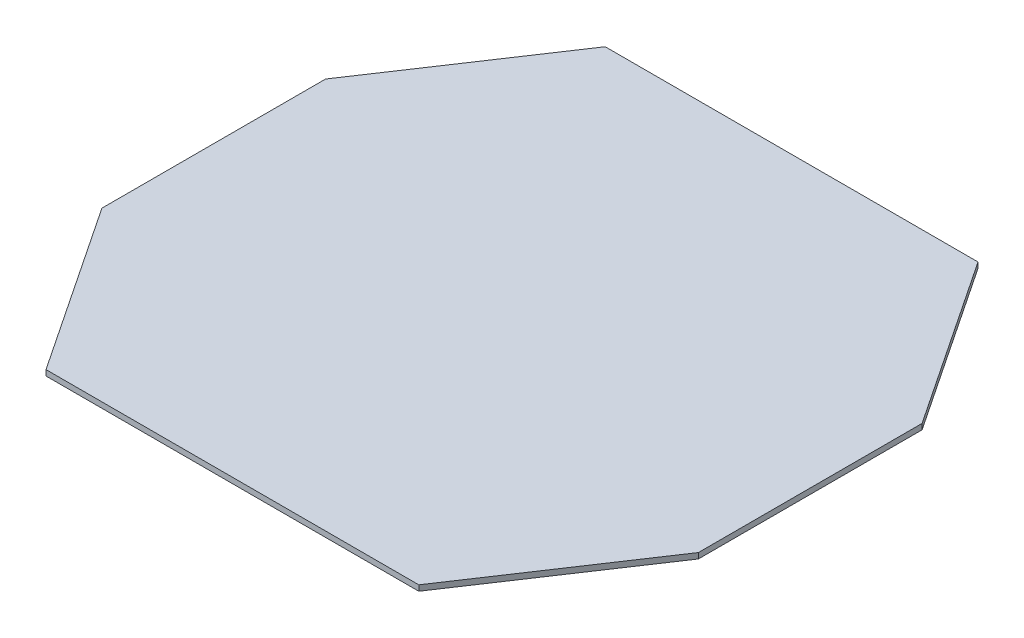
ISO-10303-21;
HEADER;
FILE_DESCRIPTION(('STEP AP214'),'2;1');
FILE_NAME('part.step','',(''),(''),'','','');
FILE_SCHEMA(('AUTOMOTIVE_DESIGN { 1 0 10303 214 1 1 1 1 }'));
ENDSEC;
DATA;
#1=APPLICATION_CONTEXT('core data for automotive mechanical design processes');
#2=APPLICATION_PROTOCOL_DEFINITION('international standard','automotive_design',2000,#1);
#3=PRODUCT_CONTEXT('',#1,'mechanical');
#4=PRODUCT('Part','Part','',(#3));
#5=PRODUCT_RELATED_PRODUCT_CATEGORY('part','',(#4));
#6=PRODUCT_DEFINITION_FORMATION('','',#4);
#7=PRODUCT_DEFINITION_CONTEXT('part definition',#1,'design');
#8=PRODUCT_DEFINITION('design','',#6,#7);
#9=PRODUCT_DEFINITION_SHAPE('','',#8);
#10=(LENGTH_UNIT() NAMED_UNIT(*) SI_UNIT(.MILLI.,.METRE.));
#11=(NAMED_UNIT(*) PLANE_ANGLE_UNIT() SI_UNIT($,.RADIAN.));
#12=(NAMED_UNIT(*) SI_UNIT($,.STERADIAN.) SOLID_ANGLE_UNIT());
#13=UNCERTAINTY_MEASURE_WITH_UNIT(LENGTH_MEASURE(1.E-05),#10,'distance_accuracy_value','');
#14=(GEOMETRIC_REPRESENTATION_CONTEXT(3) GLOBAL_UNCERTAINTY_ASSIGNED_CONTEXT((#13)) GLOBAL_UNIT_ASSIGNED_CONTEXT((#10,
#11,#12)) REPRESENTATION_CONTEXT('',''));
#15=CARTESIAN_POINT('',(0.,0.,0.));
#16=DIRECTION('',(0.,0.,1.));
#17=DIRECTION('',(1.,0.,0.));
#18=AXIS2_PLACEMENT_3D('',#15,#16,#17);
#19=CARTESIAN_POINT('',(-160.,3.,-60.));
#20=DIRECTION('',(0.832050294337844,0.,0.554700196225229));
#21=DIRECTION('',(0.554700196225229,0.,-0.832050294337844));
#22=AXIS2_PLACEMENT_3D('',#19,#20,#21);
#23=PLANE('',#22);
#24=DIRECTION('',(-0.554700196225229,0.,0.832050294337844));
#25=VECTOR('',#24,1.);
#26=CARTESIAN_POINT('',(-160.,0.,-60.));
#27=LINE('',#26,#25);
#28=CARTESIAN_POINT('',(-100.,0.,-150.));
#29=VERTEX_POINT('',#28);
#30=CARTESIAN_POINT('',(-160.,0.,-60.));
#31=VERTEX_POINT('',#30);
#32=EDGE_CURVE('E129',#29,#31,#27,.T.);
#33=ORIENTED_EDGE('',*,*,#32,.T.);
#34=DIRECTION('',(0.,-1.,0.));
#35=VECTOR('',#34,1.);
#36=CARTESIAN_POINT('',(-160.,3.,-60.));
#37=LINE('',#36,#35);
#38=CARTESIAN_POINT('',(-160.,3.,-60.));
#39=VERTEX_POINT('',#38);
#40=EDGE_CURVE('E11',#39,#31,#37,.T.);
#41=ORIENTED_EDGE('',*,*,#40,.F.);
#42=DIRECTION('',(-0.554700196225229,0.,0.832050294337844));
#43=VECTOR('',#42,1.);
#44=CARTESIAN_POINT('',(-160.,3.,-60.));
#45=LINE('',#44,#43);
#46=CARTESIAN_POINT('',(-100.,3.,-150.));
#47=VERTEX_POINT('',#46);
#48=EDGE_CURVE('E143',#47,#39,#45,.T.);
#49=ORIENTED_EDGE('',*,*,#48,.F.);
#50=DIRECTION('',(0.,-1.,0.));
#51=VECTOR('',#50,1.);
#52=CARTESIAN_POINT('',(-100.,3.,-150.));
#53=LINE('',#52,#51);
#54=EDGE_CURVE('E125',#47,#29,#53,.T.);
#55=ORIENTED_EDGE('',*,*,#54,.T.);
#56=EDGE_LOOP('',(#33,#41,#49,#55));
#57=FACE_BOUND('',#56,.T.);
#58=ADVANCED_FACE('F33',(#57),#23,.F.);
#59=CARTESIAN_POINT('',(-160.,3.,60.));
#60=DIRECTION('',(1.,0.,0.));
#61=DIRECTION('',(0.,0.,-1.));
#62=AXIS2_PLACEMENT_3D('',#59,#60,#61);
#63=PLANE('',#62);
#64=DIRECTION('',(0.,0.,1.));
#65=VECTOR('',#64,1.);
#66=CARTESIAN_POINT('',(-160.,0.,60.));
#67=LINE('',#66,#65);
#68=CARTESIAN_POINT('',(-160.,0.,60.));
#69=VERTEX_POINT('',#68);
#70=EDGE_CURVE('E132',#31,#69,#67,.T.);
#71=ORIENTED_EDGE('',*,*,#70,.T.);
#72=DIRECTION('',(0.,-1.,0.));
#73=VECTOR('',#72,1.);
#74=CARTESIAN_POINT('',(-160.,3.,60.));
#75=LINE('',#74,#73);
#76=CARTESIAN_POINT('',(-160.,3.,60.));
#77=VERTEX_POINT('',#76);
#78=EDGE_CURVE('E41',#77,#69,#75,.T.);
#79=ORIENTED_EDGE('',*,*,#78,.F.);
#80=DIRECTION('',(0.,0.,1.));
#81=VECTOR('',#80,1.);
#82=CARTESIAN_POINT('',(-160.,3.,60.));
#83=LINE('',#82,#81);
#84=EDGE_CURVE('E92',#39,#77,#83,.T.);
#85=ORIENTED_EDGE('',*,*,#84,.F.);
#86=ORIENTED_EDGE('',*,*,#40,.T.);
#87=EDGE_LOOP('',(#71,#79,#85,#86));
#88=FACE_BOUND('',#87,.T.);
#89=ADVANCED_FACE('F178',(#88),#63,.F.);
#90=CARTESIAN_POINT('',(-100.,3.,150.));
#91=DIRECTION('',(0.832050294337843,0.,-0.554700196225229));
#92=DIRECTION('',(-0.554700196225229,0.,-0.832050294337844));
#93=AXIS2_PLACEMENT_3D('',#90,#91,#92);
#94=PLANE('',#93);
#95=DIRECTION('',(0.554700196225229,0.,0.832050294337844));
#96=VECTOR('',#95,1.);
#97=CARTESIAN_POINT('',(-100.,0.,150.));
#98=LINE('',#97,#96);
#99=CARTESIAN_POINT('',(-100.,0.,150.));
#100=VERTEX_POINT('',#99);
#101=EDGE_CURVE('E134',#69,#100,#98,.T.);
#102=ORIENTED_EDGE('',*,*,#101,.T.);
#103=DIRECTION('',(0.,-1.,0.));
#104=VECTOR('',#103,1.);
#105=CARTESIAN_POINT('',(-100.,3.,150.));
#106=LINE('',#105,#104);
#107=CARTESIAN_POINT('',(-100.,3.,150.));
#108=VERTEX_POINT('',#107);
#109=EDGE_CURVE('E150',#108,#100,#106,.T.);
#110=ORIENTED_EDGE('',*,*,#109,.F.);
#111=DIRECTION('',(0.554700196225229,0.,0.832050294337844));
#112=VECTOR('',#111,1.);
#113=CARTESIAN_POINT('',(-100.,3.,150.));
#114=LINE('',#113,#112);
#115=EDGE_CURVE('E158',#77,#108,#114,.T.);
#116=ORIENTED_EDGE('',*,*,#115,.F.);
#117=ORIENTED_EDGE('',*,*,#78,.T.);
#118=EDGE_LOOP('',(#102,#110,#116,#117));
#119=FACE_BOUND('',#118,.T.);
#120=ADVANCED_FACE('F156',(#119),#94,.F.);
#121=CARTESIAN_POINT('',(100.,3.,150.));
#122=DIRECTION('',(0.,0.,-1.));
#123=DIRECTION('',(-1.,0.,0.));
#124=AXIS2_PLACEMENT_3D('',#121,#122,#123);
#125=PLANE('',#124);
#126=DIRECTION('',(1.,0.,0.));
#127=VECTOR('',#126,1.);
#128=CARTESIAN_POINT('',(100.,0.,150.));
#129=LINE('',#128,#127);
#130=CARTESIAN_POINT('',(100.,0.,150.));
#131=VERTEX_POINT('',#130);
#132=EDGE_CURVE('E136',#100,#131,#129,.T.);
#133=ORIENTED_EDGE('',*,*,#132,.T.);
#134=DIRECTION('',(0.,-1.,0.));
#135=VECTOR('',#134,1.);
#136=CARTESIAN_POINT('',(100.,3.,150.));
#137=LINE('',#136,#135);
#138=CARTESIAN_POINT('',(100.,3.,150.));
#139=VERTEX_POINT('',#138);
#140=EDGE_CURVE('E147',#139,#131,#137,.T.);
#141=ORIENTED_EDGE('',*,*,#140,.F.);
#142=DIRECTION('',(1.,0.,0.));
#143=VECTOR('',#142,1.);
#144=CARTESIAN_POINT('',(100.,3.,150.));
#145=LINE('',#144,#143);
#146=EDGE_CURVE('E170',#108,#139,#145,.T.);
#147=ORIENTED_EDGE('',*,*,#146,.F.);
#148=ORIENTED_EDGE('',*,*,#109,.T.);
#149=EDGE_LOOP('',(#133,#141,#147,#148));
#150=FACE_BOUND('',#149,.T.);
#151=ADVANCED_FACE('F166',(#150),#125,.F.);
#152=CARTESIAN_POINT('',(160.,3.,60.));
#153=DIRECTION('',(-0.832050294337844,0.,-0.554700196225229));
#154=DIRECTION('',(-0.554700196225229,0.,0.832050294337844));
#155=AXIS2_PLACEMENT_3D('',#152,#153,#154);
#156=PLANE('',#155);
#157=DIRECTION('',(0.554700196225229,0.,-0.832050294337844));
#158=VECTOR('',#157,1.);
#159=CARTESIAN_POINT('',(160.,0.,60.));
#160=LINE('',#159,#158);
#161=CARTESIAN_POINT('',(160.,0.,60.));
#162=VERTEX_POINT('',#161);
#163=EDGE_CURVE('E138',#131,#162,#160,.T.);
#164=ORIENTED_EDGE('',*,*,#163,.T.);
#165=DIRECTION('',(0.,-1.,0.));
#166=VECTOR('',#165,1.);
#167=CARTESIAN_POINT('',(160.,3.,60.));
#168=LINE('',#167,#166);
#169=CARTESIAN_POINT('',(160.,3.,60.));
#170=VERTEX_POINT('',#169);
#171=EDGE_CURVE('E120',#170,#162,#168,.T.);
#172=ORIENTED_EDGE('',*,*,#171,.F.);
#173=DIRECTION('',(0.554700196225229,0.,-0.832050294337844));
#174=VECTOR('',#173,1.);
#175=CARTESIAN_POINT('',(160.,3.,60.));
#176=LINE('',#175,#174);
#177=EDGE_CURVE('E111',#139,#170,#176,.T.);
#178=ORIENTED_EDGE('',*,*,#177,.F.);
#179=ORIENTED_EDGE('',*,*,#140,.T.);
#180=EDGE_LOOP('',(#164,#172,#178,#179));
#181=FACE_BOUND('',#180,.T.);
#182=ADVANCED_FACE('F169',(#181),#156,.F.);
#183=CARTESIAN_POINT('',(160.,3.,-60.));
#184=DIRECTION('',(-1.,0.,0.));
#185=DIRECTION('',(0.,0.,1.));
#186=AXIS2_PLACEMENT_3D('',#183,#184,#185);
#187=PLANE('',#186);
#188=DIRECTION('',(0.,0.,-1.));
#189=VECTOR('',#188,1.);
#190=CARTESIAN_POINT('',(160.,0.,-60.));
#191=LINE('',#190,#189);
#192=CARTESIAN_POINT('',(160.,0.,-60.));
#193=VERTEX_POINT('',#192);
#194=EDGE_CURVE('E119',#162,#193,#191,.T.);
#195=ORIENTED_EDGE('',*,*,#194,.T.);
#196=DIRECTION('',(0.,-1.,0.));
#197=VECTOR('',#196,1.);
#198=CARTESIAN_POINT('',(160.,3.,-60.));
#199=LINE('',#198,#197);
#200=CARTESIAN_POINT('',(160.,3.,-60.));
#201=VERTEX_POINT('',#200);
#202=EDGE_CURVE('E116',#201,#193,#199,.T.);
#203=ORIENTED_EDGE('',*,*,#202,.F.);
#204=DIRECTION('',(0.,0.,-1.));
#205=VECTOR('',#204,1.);
#206=CARTESIAN_POINT('',(160.,3.,-60.));
#207=LINE('',#206,#205);
#208=EDGE_CURVE('E105',#170,#201,#207,.T.);
#209=ORIENTED_EDGE('',*,*,#208,.F.);
#210=ORIENTED_EDGE('',*,*,#171,.T.);
#211=EDGE_LOOP('',(#195,#203,#209,#210));
#212=FACE_BOUND('',#211,.T.);
#213=ADVANCED_FACE('F117',(#212),#187,.F.);
#214=CARTESIAN_POINT('',(100.,3.,-150.));
#215=DIRECTION('',(-0.832050294337844,0.,0.554700196225229));
#216=DIRECTION('',(0.554700196225229,0.,0.832050294337843));
#217=AXIS2_PLACEMENT_3D('',#214,#215,#216);
#218=PLANE('',#217);
#219=DIRECTION('',(-0.554700196225229,0.,-0.832050294337844));
#220=VECTOR('',#219,1.);
#221=CARTESIAN_POINT('',(100.,0.,-150.));
#222=LINE('',#221,#220);
#223=CARTESIAN_POINT('',(100.,0.,-150.));
#224=VERTEX_POINT('',#223);
#225=EDGE_CURVE('E78',#193,#224,#222,.T.);
#226=ORIENTED_EDGE('',*,*,#225,.T.);
#227=DIRECTION('',(0.,-1.,0.));
#228=VECTOR('',#227,1.);
#229=CARTESIAN_POINT('',(100.,3.,-150.));
#230=LINE('',#229,#228);
#231=CARTESIAN_POINT('',(100.,3.,-150.));
#232=VERTEX_POINT('',#231);
#233=EDGE_CURVE('E121',#232,#224,#230,.T.);
#234=ORIENTED_EDGE('',*,*,#233,.F.);
#235=DIRECTION('',(-0.554700196225229,0.,-0.832050294337844));
#236=VECTOR('',#235,1.);
#237=CARTESIAN_POINT('',(100.,3.,-150.));
#238=LINE('',#237,#236);
#239=EDGE_CURVE('E109',#201,#232,#238,.T.);
#240=ORIENTED_EDGE('',*,*,#239,.F.);
#241=ORIENTED_EDGE('',*,*,#202,.T.);
#242=EDGE_LOOP('',(#226,#234,#240,#241));
#243=FACE_BOUND('',#242,.T.);
#244=ADVANCED_FACE('F123',(#243),#218,.F.);
#245=CARTESIAN_POINT('',(-100.,3.,-150.));
#246=DIRECTION('',(0.,0.,1.));
#247=DIRECTION('',(1.,0.,0.));
#248=AXIS2_PLACEMENT_3D('',#245,#246,#247);
#249=PLANE('',#248);
#250=DIRECTION('',(-1.,0.,0.));
#251=VECTOR('',#250,1.);
#252=CARTESIAN_POINT('',(-100.,0.,-150.));
#253=LINE('',#252,#251);
#254=EDGE_CURVE('E84',#224,#29,#253,.T.);
#255=ORIENTED_EDGE('',*,*,#254,.T.);
#256=ORIENTED_EDGE('',*,*,#54,.F.);
#257=DIRECTION('',(-1.,0.,0.));
#258=VECTOR('',#257,1.);
#259=CARTESIAN_POINT('',(-100.,3.,-150.));
#260=LINE('',#259,#258);
#261=EDGE_CURVE('E49',#232,#47,#260,.T.);
#262=ORIENTED_EDGE('',*,*,#261,.F.);
#263=ORIENTED_EDGE('',*,*,#233,.T.);
#264=EDGE_LOOP('',(#255,#256,#262,#263));
#265=FACE_BOUND('',#264,.T.);
#266=ADVANCED_FACE('F194',(#265),#249,.F.);
#267=CARTESIAN_POINT('',(0.,3.,0.));
#268=DIRECTION('',(0.,-1.,0.));
#269=DIRECTION('',(0.,0.,-1.));
#270=AXIS2_PLACEMENT_3D('',#267,#268,#269);
#271=PLANE('',#270);
#272=ORIENTED_EDGE('',*,*,#48,.T.);
#273=ORIENTED_EDGE('',*,*,#84,.T.);
#274=ORIENTED_EDGE('',*,*,#115,.T.);
#275=ORIENTED_EDGE('',*,*,#146,.T.);
#276=ORIENTED_EDGE('',*,*,#177,.T.);
#277=ORIENTED_EDGE('',*,*,#208,.T.);
#278=ORIENTED_EDGE('',*,*,#239,.T.);
#279=ORIENTED_EDGE('',*,*,#261,.T.);
#280=EDGE_LOOP('',(#272,#273,#274,#275,#276,#277,#278,#279));
#281=FACE_BOUND('',#280,.T.);
#282=ADVANCED_FACE('F107',(#281),#271,.F.);
#283=CARTESIAN_POINT('',(0.,0.,0.));
#284=DIRECTION('',(0.,-1.,0.));
#285=DIRECTION('',(0.,0.,-1.));
#286=AXIS2_PLACEMENT_3D('',#283,#284,#285);
#287=PLANE('',#286);
#288=ORIENTED_EDGE('',*,*,#32,.F.);
#289=ORIENTED_EDGE('',*,*,#254,.F.);
#290=ORIENTED_EDGE('',*,*,#225,.F.);
#291=ORIENTED_EDGE('',*,*,#194,.F.);
#292=ORIENTED_EDGE('',*,*,#163,.F.);
#293=ORIENTED_EDGE('',*,*,#132,.F.);
#294=ORIENTED_EDGE('',*,*,#101,.F.);
#295=ORIENTED_EDGE('',*,*,#70,.F.);
#296=EDGE_LOOP('',(#288,#289,#290,#291,#292,#293,#294,#295));
#297=FACE_BOUND('',#296,.T.);
#298=ADVANCED_FACE('F162',(#297),#287,.T.);
#299=CLOSED_SHELL('',(#58,#89,#120,#151,#182,#213,#244,#266,#282,#298));
#300=MANIFOLD_SOLID_BREP('B2',#299);
#301=ADVANCED_BREP_SHAPE_REPRESENTATION('',(#18,#300),#14);
#302=SHAPE_DEFINITION_REPRESENTATION(#9,#301);
ENDSEC;
END-ISO-10303-21;
